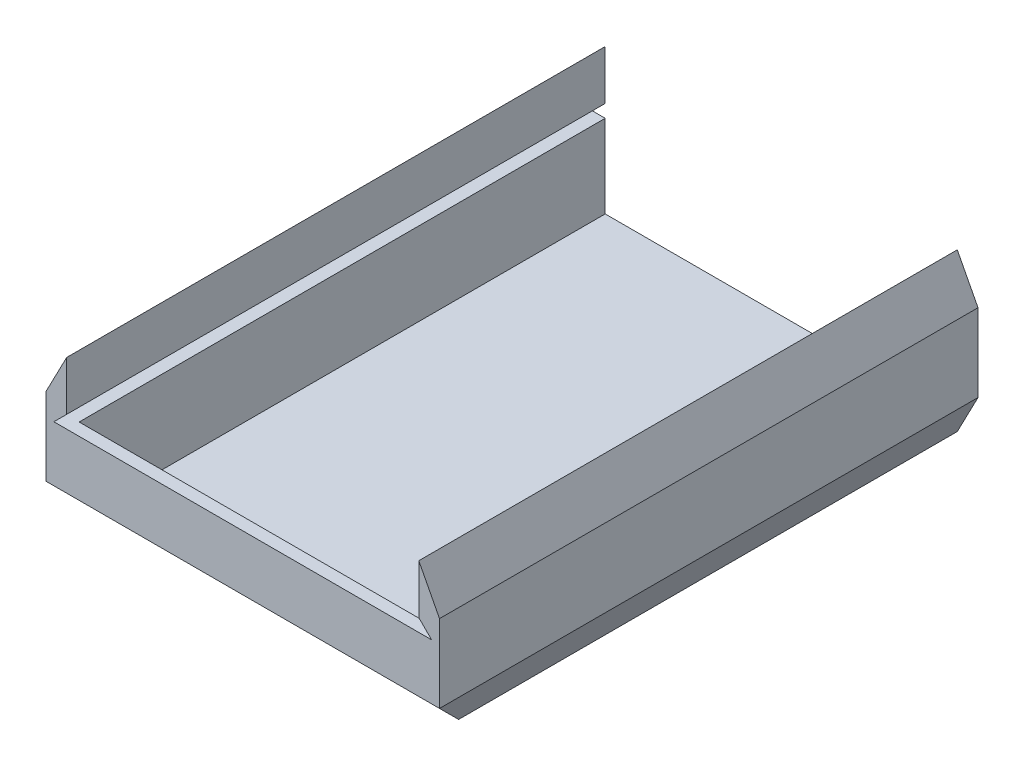
ISO-10303-21;
HEADER;
FILE_DESCRIPTION(('STEP AP214'),'2;1');
FILE_NAME('part.step','',(''),(''),'','','');
FILE_SCHEMA(('AUTOMOTIVE_DESIGN { 1 0 10303 214 1 1 1 1 }'));
ENDSEC;
DATA;
#1=APPLICATION_CONTEXT('core data for automotive mechanical design processes');
#2=APPLICATION_PROTOCOL_DEFINITION('international standard','automotive_design',2000,#1);
#3=PRODUCT_CONTEXT('',#1,'mechanical');
#4=PRODUCT('Part','Part','',(#3));
#5=PRODUCT_RELATED_PRODUCT_CATEGORY('part','',(#4));
#6=PRODUCT_DEFINITION_FORMATION('','',#4);
#7=PRODUCT_DEFINITION_CONTEXT('part definition',#1,'design');
#8=PRODUCT_DEFINITION('design','',#6,#7);
#9=PRODUCT_DEFINITION_SHAPE('','',#8);
#10=(LENGTH_UNIT() NAMED_UNIT(*) SI_UNIT(.MILLI.,.METRE.));
#11=(NAMED_UNIT(*) PLANE_ANGLE_UNIT() SI_UNIT($,.RADIAN.));
#12=(NAMED_UNIT(*) SI_UNIT($,.STERADIAN.) SOLID_ANGLE_UNIT());
#13=UNCERTAINTY_MEASURE_WITH_UNIT(LENGTH_MEASURE(1.E-05),#10,'distance_accuracy_value','');
#14=(GEOMETRIC_REPRESENTATION_CONTEXT(3) GLOBAL_UNCERTAINTY_ASSIGNED_CONTEXT((#13)) GLOBAL_UNIT_ASSIGNED_CONTEXT((#10,
#11,#12)) REPRESENTATION_CONTEXT('',''));
#15=CARTESIAN_POINT('',(0.,0.,0.));
#16=DIRECTION('',(0.,0.,1.));
#17=DIRECTION('',(1.,0.,0.));
#18=AXIS2_PLACEMENT_3D('',#15,#16,#17);
#19=CARTESIAN_POINT('',(0.,38.,-130.));
#20=DIRECTION('',(1.,0.,0.));
#21=DIRECTION('',(0.,1.,0.));
#22=AXIS2_PLACEMENT_3D('',#19,#20,#21);
#23=PLANE('',#22);
#24=DIRECTION('',(0.,-1.,0.));
#25=VECTOR('',#24,1.);
#26=CARTESIAN_POINT('',(0.,23.,-3.));
#27=LINE('',#26,#25);
#28=CARTESIAN_POINT('',(0.,23.,-3.));
#29=VERTEX_POINT('',#28);
#30=CARTESIAN_POINT('',(0.,8.,-3.));
#31=VERTEX_POINT('',#30);
#32=EDGE_CURVE('E325',#29,#31,#27,.T.);
#33=ORIENTED_EDGE('',*,*,#32,.T.);
#34=DIRECTION('',(0.,0.707106781186545,0.70710678118655));
#35=VECTOR('',#34,1.);
#36=CARTESIAN_POINT('',(0.,-40.5000000000001,-51.5000000000005));
#37=LINE('',#36,#35);
#38=CARTESIAN_POINT('',(0.,3.,-8.00000000000004));
#39=VERTEX_POINT('',#38);
#40=EDGE_CURVE('E11',#31,#39,#37,.F.);
#41=ORIENTED_EDGE('',*,*,#40,.T.);
#42=DIRECTION('',(0.,0.,1.));
#43=VECTOR('',#42,1.);
#44=CARTESIAN_POINT('',(0.,3.,0.));
#45=LINE('',#44,#43);
#46=CARTESIAN_POINT('',(0.,3.,-130.));
#47=VERTEX_POINT('',#46);
#48=EDGE_CURVE('E180',#47,#39,#45,.T.);
#49=ORIENTED_EDGE('',*,*,#48,.F.);
#50=DIRECTION('',(0.,1.,0.));
#51=VECTOR('',#50,1.);
#52=CARTESIAN_POINT('',(0.,38.,-130.));
#53=LINE('',#52,#51);
#54=CARTESIAN_POINT('',(0.,23.,-130.));
#55=VERTEX_POINT('',#54);
#56=EDGE_CURVE('E174',#47,#55,#53,.T.);
#57=ORIENTED_EDGE('',*,*,#56,.T.);
#58=DIRECTION('',(0.,0.,1.));
#59=VECTOR('',#58,1.);
#60=CARTESIAN_POINT('',(0.,23.,-130.));
#61=LINE('',#60,#59);
#62=EDGE_CURVE('E157',#55,#29,#61,.T.);
#63=ORIENTED_EDGE('',*,*,#62,.T.);
#64=EDGE_LOOP('',(#33,#41,#49,#57,#63));
#65=FACE_BOUND('',#64,.T.);
#66=ADVANCED_FACE('F33',(#65),#23,.T.);
#67=CARTESIAN_POINT('',(0.,3.,0.));
#68=DIRECTION('',(0.,-1.,0.));
#69=DIRECTION('',(0.,0.,-1.));
#70=AXIS2_PLACEMENT_3D('',#67,#68,#69);
#71=PLANE('',#70);
#72=ORIENTED_EDGE('',*,*,#48,.T.);
#73=DIRECTION('',(1.,0.,0.));
#74=VECTOR('',#73,1.);
#75=CARTESIAN_POINT('',(85.,3.,-8.00000000000004));
#76=LINE('',#75,#74);
#77=CARTESIAN_POINT('',(85.,3.,-8.00000000000004));
#78=VERTEX_POINT('',#77);
#79=EDGE_CURVE('E236',#39,#78,#76,.T.);
#80=ORIENTED_EDGE('',*,*,#79,.T.);
#81=DIRECTION('',(0.,0.,-1.));
#82=VECTOR('',#81,1.);
#83=CARTESIAN_POINT('',(85.,3.,0.));
#84=LINE('',#83,#82);
#85=CARTESIAN_POINT('',(85.,3.,-130.));
#86=VERTEX_POINT('',#85);
#87=EDGE_CURVE('E212',#78,#86,#84,.T.);
#88=ORIENTED_EDGE('',*,*,#87,.T.);
#89=DIRECTION('',(-1.,0.,0.));
#90=VECTOR('',#89,1.);
#91=CARTESIAN_POINT('',(0.,3.,-130.));
#92=LINE('',#91,#90);
#93=EDGE_CURVE('E215',#86,#47,#92,.T.);
#94=ORIENTED_EDGE('',*,*,#93,.T.);
#95=EDGE_LOOP('',(#72,#80,#88,#94));
#96=FACE_BOUND('',#95,.T.);
#97=ADVANCED_FACE('F241',(#96),#71,.F.);
#98=CARTESIAN_POINT('',(85.,38.,-130.));
#99=DIRECTION('',(-1.,0.,0.));
#100=DIRECTION('',(0.,0.,1.));
#101=AXIS2_PLACEMENT_3D('',#98,#99,#100);
#102=PLANE('',#101);
#103=ORIENTED_EDGE('',*,*,#87,.F.);
#104=DIRECTION('',(0.,-0.707106781186545,-0.70710678118655));
#105=VECTOR('',#104,1.);
#106=CARTESIAN_POINT('',(85.,-40.5000000000001,-51.5000000000005));
#107=LINE('',#106,#105);
#108=CARTESIAN_POINT('',(85.,8.,-3.));
#109=VERTEX_POINT('',#108);
#110=EDGE_CURVE('E55',#78,#109,#107,.F.);
#111=ORIENTED_EDGE('',*,*,#110,.T.);
#112=DIRECTION('',(0.,1.,0.));
#113=VECTOR('',#112,1.);
#114=CARTESIAN_POINT('',(85.,23.,-3.));
#115=LINE('',#114,#113);
#116=CARTESIAN_POINT('',(85.,23.,-3.));
#117=VERTEX_POINT('',#116);
#118=EDGE_CURVE('E323',#109,#117,#115,.T.);
#119=ORIENTED_EDGE('',*,*,#118,.T.);
#120=DIRECTION('',(0.,0.,1.));
#121=VECTOR('',#120,1.);
#122=CARTESIAN_POINT('',(85.,23.,-130.));
#123=LINE('',#122,#121);
#124=CARTESIAN_POINT('',(85.,23.,-130.));
#125=VERTEX_POINT('',#124);
#126=EDGE_CURVE('E249',#125,#117,#123,.T.);
#127=ORIENTED_EDGE('',*,*,#126,.F.);
#128=DIRECTION('',(0.,-1.,0.));
#129=VECTOR('',#128,1.);
#130=CARTESIAN_POINT('',(85.,38.,-130.));
#131=LINE('',#130,#129);
#132=EDGE_CURVE('E248',#125,#86,#131,.T.);
#133=ORIENTED_EDGE('',*,*,#132,.T.);
#134=EDGE_LOOP('',(#103,#111,#119,#127,#133));
#135=FACE_BOUND('',#134,.T.);
#136=ADVANCED_FACE('F245',(#135),#102,.T.);
#137=DIRECTION('',(0.,0.,1.));
#138=VECTOR('',#137,1.);
#139=CARTESIAN_POINT('',(85.,26.1,-130.));
#140=LINE('',#139,#138);
#141=CARTESIAN_POINT('',(85.,26.1,-130.));
#142=VERTEX_POINT('',#141);
#143=CARTESIAN_POINT('',(85.,26.1,0.));
#144=VERTEX_POINT('',#143);
#145=EDGE_CURVE('E306',#142,#144,#140,.T.);
#146=ORIENTED_EDGE('',*,*,#145,.T.);
#147=DIRECTION('',(0.,-1.,0.));
#148=VECTOR('',#147,1.);
#149=CARTESIAN_POINT('',(85.,38.,0.));
#150=LINE('',#149,#148);
#151=CARTESIAN_POINT('',(85.,38.,0.));
#152=VERTEX_POINT('',#151);
#153=EDGE_CURVE('E267',#152,#144,#150,.T.);
#154=ORIENTED_EDGE('',*,*,#153,.F.);
#155=DIRECTION('',(0.,0.,1.));
#156=VECTOR('',#155,1.);
#157=CARTESIAN_POINT('',(85.,38.,-130.));
#158=LINE('',#157,#156);
#159=CARTESIAN_POINT('',(85.,38.,-130.));
#160=VERTEX_POINT('',#159);
#161=EDGE_CURVE('E197',#160,#152,#158,.T.);
#162=ORIENTED_EDGE('',*,*,#161,.F.);
#163=EDGE_CURVE('E251',#160,#142,#131,.T.);
#164=ORIENTED_EDGE('',*,*,#163,.T.);
#165=EDGE_LOOP('',(#146,#154,#162,#164));
#166=FACE_BOUND('',#165,.T.);
#167=ADVANCED_FACE('F369',(#166),#102,.T.);
#168=CARTESIAN_POINT('',(0.,3.,0.));
#169=DIRECTION('',(0.,0.,-1.));
#170=DIRECTION('',(-1.,0.,0.));
#171=AXIS2_PLACEMENT_3D('',#168,#169,#170);
#172=PLANE('',#171);
#173=DIRECTION('',(0.,-1.,0.));
#174=VECTOR('',#173,1.);
#175=CARTESIAN_POINT('',(-5.,9.60906334512409,0.));
#176=LINE('',#175,#174);
#177=CARTESIAN_POINT('',(-5.,28.3909366548759,0.));
#178=VERTEX_POINT('',#177);
#179=CARTESIAN_POINT('',(-5.,9.60999999999998,0.));
#180=VERTEX_POINT('',#179);
#181=EDGE_CURVE('E200',#178,#180,#176,.T.);
#182=ORIENTED_EDGE('',*,*,#181,.T.);
#183=DIRECTION('',(1.,0.,0.));
#184=VECTOR('',#183,1.);
#185=CARTESIAN_POINT('',(85.,9.60999999999998,0.));
#186=LINE('',#185,#184);
#187=CARTESIAN_POINT('',(90.,9.60999999999998,0.));
#188=VERTEX_POINT('',#187);
#189=EDGE_CURVE('E217',#180,#188,#186,.T.);
#190=ORIENTED_EDGE('',*,*,#189,.T.);
#191=DIRECTION('',(0.,1.,0.));
#192=VECTOR('',#191,1.);
#193=CARTESIAN_POINT('',(90.,9.60906334512409,0.));
#194=LINE('',#193,#192);
#195=CARTESIAN_POINT('',(90.,28.3909366548759,0.));
#196=VERTEX_POINT('',#195);
#197=EDGE_CURVE('E261',#188,#196,#194,.T.);
#198=ORIENTED_EDGE('',*,*,#197,.T.);
#199=DIRECTION('',(-0.461591586339288,0.887092558542106,0.));
#200=VECTOR('',#199,1.);
#201=CARTESIAN_POINT('',(90.,28.3909366548759,0.));
#202=LINE('',#201,#200);
#203=EDGE_CURVE('E263',#196,#152,#202,.T.);
#204=ORIENTED_EDGE('',*,*,#203,.T.);
#205=ORIENTED_EDGE('',*,*,#153,.T.);
#206=DIRECTION('',(-0.707106781186547,0.707106781186548,0.));
#207=VECTOR('',#206,1.);
#208=CARTESIAN_POINT('',(88.1,23.,0.));
#209=LINE('',#208,#207);
#210=CARTESIAN_POINT('',(88.1,23.,0.));
#211=VERTEX_POINT('',#210);
#212=EDGE_CURVE('E310',#211,#144,#209,.T.);
#213=ORIENTED_EDGE('',*,*,#212,.F.);
#214=DIRECTION('',(1.,0.,0.));
#215=VECTOR('',#214,1.);
#216=CARTESIAN_POINT('',(0.,23.,0.));
#217=LINE('',#216,#215);
#218=CARTESIAN_POINT('',(-3.1,23.,0.));
#219=VERTEX_POINT('',#218);
#220=EDGE_CURVE('E309',#219,#211,#217,.T.);
#221=ORIENTED_EDGE('',*,*,#220,.F.);
#222=DIRECTION('',(-0.707106781186548,-0.707106781186547,0.));
#223=VECTOR('',#222,1.);
#224=CARTESIAN_POINT('',(-3.1,23.,0.));
#225=LINE('',#224,#223);
#226=CARTESIAN_POINT('',(0.,26.1,0.));
#227=VERTEX_POINT('',#226);
#228=EDGE_CURVE('E177',#227,#219,#225,.T.);
#229=ORIENTED_EDGE('',*,*,#228,.F.);
#230=DIRECTION('',(0.,1.,0.));
#231=VECTOR('',#230,1.);
#232=CARTESIAN_POINT('',(0.,38.,0.));
#233=LINE('',#232,#231);
#234=CARTESIAN_POINT('',(0.,38.,0.));
#235=VERTEX_POINT('',#234);
#236=EDGE_CURVE('E194',#227,#235,#233,.T.);
#237=ORIENTED_EDGE('',*,*,#236,.T.);
#238=DIRECTION('',(-0.461591586339287,-0.887092558542106,0.));
#239=VECTOR('',#238,1.);
#240=CARTESIAN_POINT('',(-5.,28.3909366548759,0.));
#241=LINE('',#240,#239);
#242=EDGE_CURVE('E196',#235,#178,#241,.T.);
#243=ORIENTED_EDGE('',*,*,#242,.T.);
#244=EDGE_LOOP('',(#182,#190,#198,#204,#205,#213,#221,#229,#237,#243));
#245=FACE_BOUND('',#244,.T.);
#246=ADVANCED_FACE('F359',(#245),#172,.F.);
#247=CARTESIAN_POINT('',(0.,3.,-130.));
#248=DIRECTION('',(0.,0.,1.));
#249=DIRECTION('',(1.,0.,0.));
#250=AXIS2_PLACEMENT_3D('',#247,#248,#249);
#251=PLANE('',#250);
#252=DIRECTION('',(-0.707106781186548,-0.707106781186547,0.));
#253=VECTOR('',#252,1.);
#254=CARTESIAN_POINT('',(-3.1,23.,-130.));
#255=LINE('',#254,#253);
#256=CARTESIAN_POINT('',(0.,26.1,-130.));
#257=VERTEX_POINT('',#256);
#258=CARTESIAN_POINT('',(-3.1,23.,-130.));
#259=VERTEX_POINT('',#258);
#260=EDGE_CURVE('E168',#257,#259,#255,.T.);
#261=ORIENTED_EDGE('',*,*,#260,.T.);
#262=DIRECTION('',(1.,0.,0.));
#263=VECTOR('',#262,1.);
#264=CARTESIAN_POINT('',(0.,23.,-130.));
#265=LINE('',#264,#263);
#266=EDGE_CURVE('E160',#259,#55,#265,.T.);
#267=ORIENTED_EDGE('',*,*,#266,.T.);
#268=ORIENTED_EDGE('',*,*,#56,.F.);
#269=ORIENTED_EDGE('',*,*,#93,.F.);
#270=ORIENTED_EDGE('',*,*,#132,.F.);
#271=DIRECTION('',(1.,0.,0.));
#272=VECTOR('',#271,1.);
#273=CARTESIAN_POINT('',(85.,23.,-130.));
#274=LINE('',#273,#272);
#275=CARTESIAN_POINT('',(88.1,23.,-130.));
#276=VERTEX_POINT('',#275);
#277=EDGE_CURVE('E312',#125,#276,#274,.T.);
#278=ORIENTED_EDGE('',*,*,#277,.T.);
#279=DIRECTION('',(-0.707106781186547,0.707106781186548,0.));
#280=VECTOR('',#279,1.);
#281=CARTESIAN_POINT('',(88.1,23.,-130.));
#282=LINE('',#281,#280);
#283=EDGE_CURVE('E303',#276,#142,#282,.T.);
#284=ORIENTED_EDGE('',*,*,#283,.T.);
#285=ORIENTED_EDGE('',*,*,#163,.F.);
#286=DIRECTION('',(-0.461591586339288,0.887092558542106,0.));
#287=VECTOR('',#286,1.);
#288=CARTESIAN_POINT('',(90.,28.3909366548759,-130.));
#289=LINE('',#288,#287);
#290=CARTESIAN_POINT('',(90.,28.3909366548759,-130.));
#291=VERTEX_POINT('',#290);
#292=EDGE_CURVE('E252',#291,#160,#289,.T.);
#293=ORIENTED_EDGE('',*,*,#292,.F.);
#294=DIRECTION('',(0.,1.,0.));
#295=VECTOR('',#294,1.);
#296=CARTESIAN_POINT('',(90.,9.60906334512409,-130.));
#297=LINE('',#296,#295);
#298=CARTESIAN_POINT('',(90.,9.60906334512409,-130.));
#299=VERTEX_POINT('',#298);
#300=EDGE_CURVE('E257',#299,#291,#297,.T.);
#301=ORIENTED_EDGE('',*,*,#300,.F.);
#302=DIRECTION('',(0.461591586339288,0.887092558542106,0.));
#303=VECTOR('',#302,1.);
#304=CARTESIAN_POINT('',(85.,0.,-130.));
#305=LINE('',#304,#303);
#306=CARTESIAN_POINT('',(85.,0.,-130.));
#307=VERTEX_POINT('',#306);
#308=EDGE_CURVE('E270',#307,#299,#305,.T.);
#309=ORIENTED_EDGE('',*,*,#308,.F.);
#310=DIRECTION('',(-1.,0.,0.));
#311=VECTOR('',#310,1.);
#312=CARTESIAN_POINT('',(0.,0.,-130.));
#313=LINE('',#312,#311);
#314=CARTESIAN_POINT('',(0.,0.,-130.));
#315=VERTEX_POINT('',#314);
#316=EDGE_CURVE('E213',#307,#315,#313,.T.);
#317=ORIENTED_EDGE('',*,*,#316,.T.);
#318=DIRECTION('',(0.461591586339287,-0.887092558542106,0.));
#319=VECTOR('',#318,1.);
#320=CARTESIAN_POINT('',(0.,0.,-130.));
#321=LINE('',#320,#319);
#322=CARTESIAN_POINT('',(-5.,9.60906334512409,-130.));
#323=VERTEX_POINT('',#322);
#324=EDGE_CURVE('E187',#323,#315,#321,.T.);
#325=ORIENTED_EDGE('',*,*,#324,.F.);
#326=DIRECTION('',(0.,-1.,0.));
#327=VECTOR('',#326,1.);
#328=CARTESIAN_POINT('',(-5.,9.60906334512409,-130.));
#329=LINE('',#328,#327);
#330=CARTESIAN_POINT('',(-5.,28.3909366548759,-130.));
#331=VERTEX_POINT('',#330);
#332=EDGE_CURVE('E185',#331,#323,#329,.T.);
#333=ORIENTED_EDGE('',*,*,#332,.F.);
#334=DIRECTION('',(-0.461591586339287,-0.887092558542106,0.));
#335=VECTOR('',#334,1.);
#336=CARTESIAN_POINT('',(-5.,28.3909366548759,-130.));
#337=LINE('',#336,#335);
#338=CARTESIAN_POINT('',(0.,38.,-130.));
#339=VERTEX_POINT('',#338);
#340=EDGE_CURVE('E181',#339,#331,#337,.T.);
#341=ORIENTED_EDGE('',*,*,#340,.F.);
#342=EDGE_CURVE('E182',#257,#339,#53,.T.);
#343=ORIENTED_EDGE('',*,*,#342,.F.);
#344=EDGE_LOOP('',(#261,#267,#268,#269,#270,#278,#284,#285,#293,#301,#309,#317,#325,#333,#341,#343));
#345=FACE_BOUND('',#344,.T.);
#346=ADVANCED_FACE('F172',(#345),#251,.F.);
#347=CARTESIAN_POINT('',(0.,0.,0.));
#348=DIRECTION('',(0.,-1.,0.));
#349=DIRECTION('',(0.,0.,-1.));
#350=AXIS2_PLACEMENT_3D('',#347,#348,#349);
#351=PLANE('',#350);
#352=DIRECTION('',(0.,0.,-1.));
#353=VECTOR('',#352,1.);
#354=CARTESIAN_POINT('',(85.,0.,0.));
#355=LINE('',#354,#353);
#356=CARTESIAN_POINT('',(85.,0.,-9.61000000000001));
#357=VERTEX_POINT('',#356);
#358=EDGE_CURVE('E220',#357,#307,#355,.T.);
#359=ORIENTED_EDGE('',*,*,#358,.F.);
#360=DIRECTION('',(-1.,0.,0.));
#361=VECTOR('',#360,1.);
#362=CARTESIAN_POINT('',(0.,0.,-9.61000000000001));
#363=LINE('',#362,#361);
#364=CARTESIAN_POINT('',(0.,0.,-9.61000000000001));
#365=VERTEX_POINT('',#364);
#366=EDGE_CURVE('E230',#357,#365,#363,.T.);
#367=ORIENTED_EDGE('',*,*,#366,.T.);
#368=DIRECTION('',(0.,0.,1.));
#369=VECTOR('',#368,1.);
#370=CARTESIAN_POINT('',(0.,0.,0.));
#371=LINE('',#370,#369);
#372=EDGE_CURVE('E206',#315,#365,#371,.T.);
#373=ORIENTED_EDGE('',*,*,#372,.F.);
#374=ORIENTED_EDGE('',*,*,#316,.F.);
#375=EDGE_LOOP('',(#359,#367,#373,#374));
#376=FACE_BOUND('',#375,.T.);
#377=ADVANCED_FACE('F292',(#376),#351,.T.);
#378=DIRECTION('',(0.,0.,1.));
#379=VECTOR('',#378,1.);
#380=CARTESIAN_POINT('',(0.,26.1,-130.));
#381=LINE('',#380,#379);
#382=EDGE_CURVE('E167',#257,#227,#381,.T.);
#383=ORIENTED_EDGE('',*,*,#382,.F.);
#384=ORIENTED_EDGE('',*,*,#342,.T.);
#385=DIRECTION('',(0.,0.,1.));
#386=VECTOR('',#385,1.);
#387=CARTESIAN_POINT('',(0.,38.,-130.));
#388=LINE('',#387,#386);
#389=EDGE_CURVE('E193',#339,#235,#388,.T.);
#390=ORIENTED_EDGE('',*,*,#389,.T.);
#391=ORIENTED_EDGE('',*,*,#236,.F.);
#392=EDGE_LOOP('',(#383,#384,#390,#391));
#393=FACE_BOUND('',#392,.T.);
#394=ADVANCED_FACE('F333',(#393),#23,.T.);
#395=CARTESIAN_POINT('',(0.,0.,-130.));
#396=DIRECTION('',(-0.887092558542106,-0.461591586339287,0.));
#397=DIRECTION('',(0.461591586339287,-0.887092558542106,0.));
#398=AXIS2_PLACEMENT_3D('',#395,#396,#397);
#399=PLANE('',#398);
#400=ORIENTED_EDGE('',*,*,#372,.T.);
#401=DIRECTION('',(-0.3453056816789,0.663612833736761,0.663612833736763));
#402=VECTOR('',#401,1.);
#403=CARTESIAN_POINT('',(27.5872820508712,-53.0175881493253,-62.6275881493254));
#404=LINE('',#403,#402);
#405=CARTESIAN_POINT('',(-5.,9.60906334512409,-0.000936654875882681));
#406=VERTEX_POINT('',#405);
#407=EDGE_CURVE('E232',#365,#406,#404,.T.);
#408=ORIENTED_EDGE('',*,*,#407,.T.);
#409=DIRECTION('',(0.,0.,1.));
#410=VECTOR('',#409,1.);
#411=CARTESIAN_POINT('',(-5.,9.60906334512409,-130.));
#412=LINE('',#411,#410);
#413=EDGE_CURVE('E203',#323,#406,#412,.T.);
#414=ORIENTED_EDGE('',*,*,#413,.F.);
#415=ORIENTED_EDGE('',*,*,#324,.T.);
#416=EDGE_LOOP('',(#400,#408,#414,#415));
#417=FACE_BOUND('',#416,.T.);
#418=ADVANCED_FACE('F295',(#417),#399,.T.);
#419=CARTESIAN_POINT('',(-5.,9.60906334512409,-130.));
#420=DIRECTION('',(-1.,0.,0.));
#421=DIRECTION('',(0.,-1.,0.));
#422=AXIS2_PLACEMENT_3D('',#419,#420,#421);
#423=PLANE('',#422);
#424=ORIENTED_EDGE('',*,*,#413,.T.);
#425=DIRECTION('',(0.,0.707106781186547,0.707106781186549));
#426=VECTOR('',#425,1.);
#427=CARTESIAN_POINT('',(-4.99999999999999,-55.390468327438,-65.0004683274381));
#428=LINE('',#427,#426);
#429=EDGE_CURVE('E234',#406,#180,#428,.T.);
#430=ORIENTED_EDGE('',*,*,#429,.T.);
#431=ORIENTED_EDGE('',*,*,#181,.F.);
#432=DIRECTION('',(0.,0.,1.));
#433=VECTOR('',#432,1.);
#434=CARTESIAN_POINT('',(-5.,28.3909366548759,-130.));
#435=LINE('',#434,#433);
#436=EDGE_CURVE('E207',#331,#178,#435,.T.);
#437=ORIENTED_EDGE('',*,*,#436,.F.);
#438=ORIENTED_EDGE('',*,*,#332,.T.);
#439=EDGE_LOOP('',(#424,#430,#431,#437,#438));
#440=FACE_BOUND('',#439,.T.);
#441=ADVANCED_FACE('F346',(#440),#423,.T.);
#442=CARTESIAN_POINT('',(-5.,28.3909366548759,-130.));
#443=DIRECTION('',(-0.887092558542106,0.461591586339287,0.));
#444=DIRECTION('',(-0.461591586339287,-0.887092558542106,0.));
#445=AXIS2_PLACEMENT_3D('',#442,#443,#444);
#446=PLANE('',#445);
#447=ORIENTED_EDGE('',*,*,#242,.F.);
#448=ORIENTED_EDGE('',*,*,#389,.F.);
#449=ORIENTED_EDGE('',*,*,#340,.T.);
#450=ORIENTED_EDGE('',*,*,#436,.T.);
#451=EDGE_LOOP('',(#447,#448,#449,#450));
#452=FACE_BOUND('',#451,.T.);
#453=ADVANCED_FACE('F356',(#452),#446,.T.);
#454=CARTESIAN_POINT('',(85.,0.,-130.));
#455=DIRECTION('',(0.887092558542106,-0.461591586339288,0.));
#456=DIRECTION('',(0.461591586339288,0.887092558542106,0.));
#457=AXIS2_PLACEMENT_3D('',#454,#455,#456);
#458=PLANE('',#457);
#459=DIRECTION('',(0.,0.,1.));
#460=VECTOR('',#459,1.);
#461=CARTESIAN_POINT('',(90.,9.60906334512409,-130.));
#462=LINE('',#461,#460);
#463=CARTESIAN_POINT('',(90.,9.60906334512409,-0.000936654875882681));
#464=VERTEX_POINT('',#463);
#465=EDGE_CURVE('E255',#299,#464,#462,.T.);
#466=ORIENTED_EDGE('',*,*,#465,.T.);
#467=DIRECTION('',(-0.3453056816789,-0.663612833736761,-0.663612833736763));
#468=VECTOR('',#467,1.);
#469=CARTESIAN_POINT('',(57.4127179491288,-53.0175881493252,-62.6275881493254));
#470=LINE('',#469,#468);
#471=EDGE_CURVE('E228',#464,#357,#470,.T.);
#472=ORIENTED_EDGE('',*,*,#471,.T.);
#473=ORIENTED_EDGE('',*,*,#358,.T.);
#474=ORIENTED_EDGE('',*,*,#308,.T.);
#475=EDGE_LOOP('',(#466,#472,#473,#474));
#476=FACE_BOUND('',#475,.T.);
#477=ADVANCED_FACE('F278',(#476),#458,.T.);
#478=CARTESIAN_POINT('',(90.,28.3909366548759,-130.));
#479=DIRECTION('',(0.887092558542106,0.461591586339288,0.));
#480=DIRECTION('',(-0.461591586339288,0.887092558542106,0.));
#481=AXIS2_PLACEMENT_3D('',#478,#479,#480);
#482=PLANE('',#481);
#483=ORIENTED_EDGE('',*,*,#203,.F.);
#484=DIRECTION('',(0.,0.,1.));
#485=VECTOR('',#484,1.);
#486=CARTESIAN_POINT('',(90.,28.3909366548759,-130.));
#487=LINE('',#486,#485);
#488=EDGE_CURVE('E272',#291,#196,#487,.T.);
#489=ORIENTED_EDGE('',*,*,#488,.F.);
#490=ORIENTED_EDGE('',*,*,#292,.T.);
#491=ORIENTED_EDGE('',*,*,#161,.T.);
#492=EDGE_LOOP('',(#483,#489,#490,#491));
#493=FACE_BOUND('',#492,.T.);
#494=ADVANCED_FACE('F365',(#493),#482,.T.);
#495=CARTESIAN_POINT('',(90.,9.60906334512409,-130.));
#496=DIRECTION('',(1.,0.,0.));
#497=DIRECTION('',(0.,0.,-1.));
#498=AXIS2_PLACEMENT_3D('',#495,#496,#497);
#499=PLANE('',#498);
#500=ORIENTED_EDGE('',*,*,#197,.F.);
#501=DIRECTION('',(0.,-0.707106781186547,-0.707106781186549));
#502=VECTOR('',#501,1.);
#503=CARTESIAN_POINT('',(90.,-55.390468327438,-65.0004683274381));
#504=LINE('',#503,#502);
#505=EDGE_CURVE('E226',#188,#464,#504,.T.);
#506=ORIENTED_EDGE('',*,*,#505,.T.);
#507=ORIENTED_EDGE('',*,*,#465,.F.);
#508=ORIENTED_EDGE('',*,*,#300,.T.);
#509=ORIENTED_EDGE('',*,*,#488,.T.);
#510=EDGE_LOOP('',(#500,#506,#507,#508,#509));
#511=FACE_BOUND('',#510,.T.);
#512=ADVANCED_FACE('F362',(#511),#499,.T.);
#513=CARTESIAN_POINT('',(88.1,23.,-130.));
#514=DIRECTION('',(0.707106781186548,0.707106781186547,0.));
#515=DIRECTION('',(-0.707106781186547,0.707106781186548,0.));
#516=AXIS2_PLACEMENT_3D('',#513,#514,#515);
#517=PLANE('',#516);
#518=ORIENTED_EDGE('',*,*,#212,.T.);
#519=ORIENTED_EDGE('',*,*,#145,.F.);
#520=ORIENTED_EDGE('',*,*,#283,.F.);
#521=DIRECTION('',(0.,0.,1.));
#522=VECTOR('',#521,1.);
#523=CARTESIAN_POINT('',(88.1,23.,-130.));
#524=LINE('',#523,#522);
#525=EDGE_CURVE('E302',#276,#211,#524,.T.);
#526=ORIENTED_EDGE('',*,*,#525,.T.);
#527=EDGE_LOOP('',(#518,#519,#520,#526));
#528=FACE_BOUND('',#527,.T.);
#529=ADVANCED_FACE('F373',(#528),#517,.F.);
#530=CARTESIAN_POINT('',(0.,23.,-130.));
#531=DIRECTION('',(0.,-1.,0.));
#532=DIRECTION('',(0.,0.,-1.));
#533=AXIS2_PLACEMENT_3D('',#530,#531,#532);
#534=PLANE('',#533);
#535=ORIENTED_EDGE('',*,*,#220,.T.);
#536=ORIENTED_EDGE('',*,*,#525,.F.);
#537=ORIENTED_EDGE('',*,*,#277,.F.);
#538=ORIENTED_EDGE('',*,*,#126,.T.);
#539=DIRECTION('',(-1.,0.,0.));
#540=VECTOR('',#539,1.);
#541=CARTESIAN_POINT('',(0.,23.,-3.));
#542=LINE('',#541,#540);
#543=EDGE_CURVE('E164',#117,#29,#542,.T.);
#544=ORIENTED_EDGE('',*,*,#543,.T.);
#545=ORIENTED_EDGE('',*,*,#62,.F.);
#546=ORIENTED_EDGE('',*,*,#266,.F.);
#547=DIRECTION('',(0.,0.,1.));
#548=VECTOR('',#547,1.);
#549=CARTESIAN_POINT('',(-3.1,23.,-130.));
#550=LINE('',#549,#548);
#551=EDGE_CURVE('E264',#259,#219,#550,.T.);
#552=ORIENTED_EDGE('',*,*,#551,.T.);
#553=EDGE_LOOP('',(#535,#536,#537,#538,#544,#545,#546,#552));
#554=FACE_BOUND('',#553,.T.);
#555=ADVANCED_FACE('F159',(#554),#534,.F.);
#556=CARTESIAN_POINT('',(-3.1,23.,-130.));
#557=DIRECTION('',(-0.707106781186547,0.707106781186548,0.));
#558=DIRECTION('',(-0.707106781186548,-0.707106781186547,0.));
#559=AXIS2_PLACEMENT_3D('',#556,#557,#558);
#560=PLANE('',#559);
#561=ORIENTED_EDGE('',*,*,#228,.T.);
#562=ORIENTED_EDGE('',*,*,#551,.F.);
#563=ORIENTED_EDGE('',*,*,#260,.F.);
#564=ORIENTED_EDGE('',*,*,#382,.T.);
#565=EDGE_LOOP('',(#561,#562,#563,#564));
#566=FACE_BOUND('',#565,.T.);
#567=ADVANCED_FACE('F375',(#566),#560,.F.);
#568=CARTESIAN_POINT('',(0.,0.,-3.));
#569=DIRECTION('',(0.,0.,1.));
#570=DIRECTION('',(1.,0.,0.));
#571=AXIS2_PLACEMENT_3D('',#568,#569,#570);
#572=PLANE('',#571);
#573=ORIENTED_EDGE('',*,*,#118,.F.);
#574=DIRECTION('',(-1.,0.,0.));
#575=VECTOR('',#574,1.);
#576=CARTESIAN_POINT('',(0.,8.,-3.));
#577=LINE('',#576,#575);
#578=EDGE_CURVE('E41',#109,#31,#577,.T.);
#579=ORIENTED_EDGE('',*,*,#578,.T.);
#580=ORIENTED_EDGE('',*,*,#32,.F.);
#581=ORIENTED_EDGE('',*,*,#543,.F.);
#582=EDGE_LOOP('',(#573,#579,#580,#581));
#583=FACE_BOUND('',#582,.T.);
#584=ADVANCED_FACE('F330',(#583),#572,.F.);
#585=CARTESIAN_POINT('',(0.,9.60999999999998,0.));
#586=DIRECTION('',(0.,-0.707106781186549,0.707106781186547));
#587=DIRECTION('',(-1.,0.,0.));
#588=AXIS2_PLACEMENT_3D('',#585,#586,#587);
#589=PLANE('',#588);
#590=ORIENTED_EDGE('',*,*,#407,.F.);
#591=ORIENTED_EDGE('',*,*,#366,.F.);
#592=ORIENTED_EDGE('',*,*,#471,.F.);
#593=ORIENTED_EDGE('',*,*,#505,.F.);
#594=ORIENTED_EDGE('',*,*,#189,.F.);
#595=ORIENTED_EDGE('',*,*,#429,.F.);
#596=EDGE_LOOP('',(#590,#591,#592,#593,#594,#595));
#597=FACE_BOUND('',#596,.T.);
#598=ADVANCED_FACE('F287',(#597),#589,.T.);
#599=CARTESIAN_POINT('',(0.,3.,-8.00000000000004));
#600=DIRECTION('',(0.,0.707106781186551,-0.707106781186545));
#601=DIRECTION('',(-1.,0.,0.));
#602=AXIS2_PLACEMENT_3D('',#599,#600,#601);
#603=PLANE('',#602);
#604=ORIENTED_EDGE('',*,*,#40,.F.);
#605=ORIENTED_EDGE('',*,*,#578,.F.);
#606=ORIENTED_EDGE('',*,*,#110,.F.);
#607=ORIENTED_EDGE('',*,*,#79,.F.);
#608=EDGE_LOOP('',(#604,#605,#606,#607));
#609=FACE_BOUND('',#608,.T.);
#610=ADVANCED_FACE('F35',(#609),#603,.T.);
#611=CLOSED_SHELL('',(#66,#97,#136,#167,#246,#346,#377,#394,#418,#441,#453,#477,#494,#512,#529,
#555,#567,#584,#598,#610));
#612=MANIFOLD_SOLID_BREP('B2',#611);
#613=ADVANCED_BREP_SHAPE_REPRESENTATION('',(#18,#612),#14);
#614=SHAPE_DEFINITION_REPRESENTATION(#9,#613);
ENDSEC;
END-ISO-10303-21;
